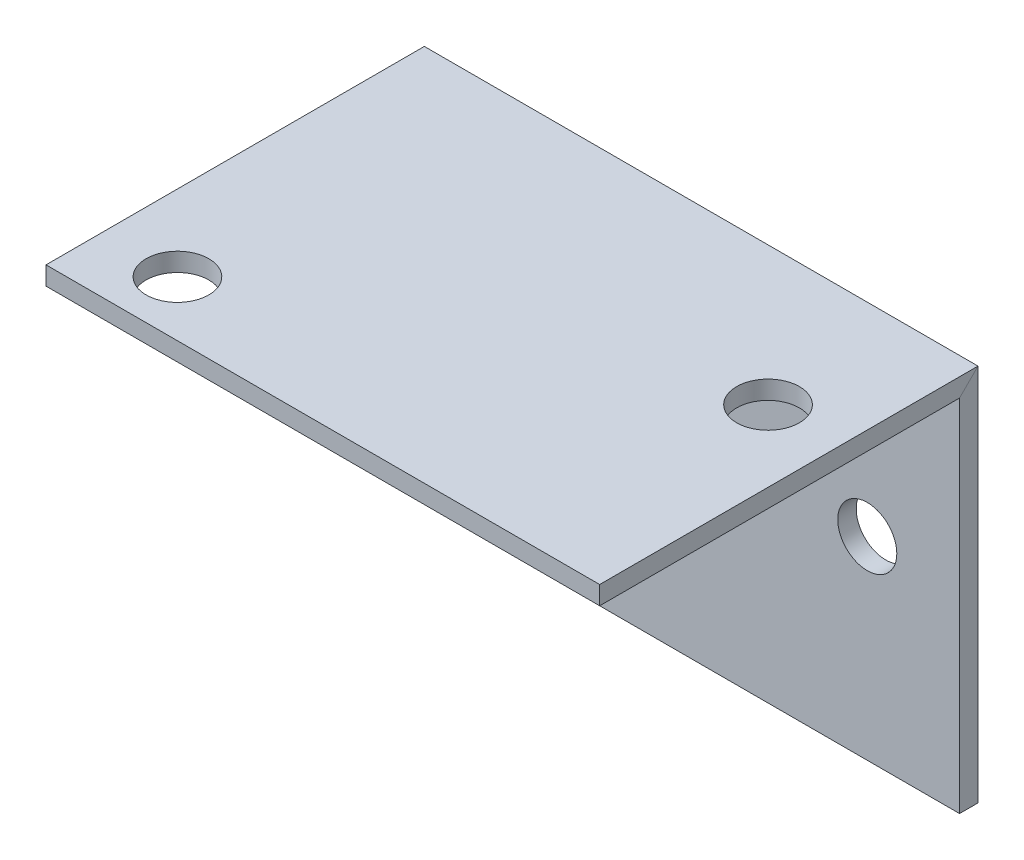
ISO-10303-21;
HEADER;
FILE_DESCRIPTION(('STEP AP214'),'2;1');
FILE_NAME('part.step','',(''),(''),'','','');
FILE_SCHEMA(('AUTOMOTIVE_DESIGN { 1 0 10303 214 1 1 1 1 }'));
ENDSEC;
DATA;
#1=APPLICATION_CONTEXT('core data for automotive mechanical design processes');
#2=APPLICATION_PROTOCOL_DEFINITION('international standard','automotive_design',2000,#1);
#3=PRODUCT_CONTEXT('',#1,'mechanical');
#4=PRODUCT('Part','Part','',(#3));
#5=PRODUCT_RELATED_PRODUCT_CATEGORY('part','',(#4));
#6=PRODUCT_DEFINITION_FORMATION('','',#4);
#7=PRODUCT_DEFINITION_CONTEXT('part definition',#1,'design');
#8=PRODUCT_DEFINITION('design','',#6,#7);
#9=PRODUCT_DEFINITION_SHAPE('','',#8);
#10=(LENGTH_UNIT() NAMED_UNIT(*) SI_UNIT(.MILLI.,.METRE.));
#11=(NAMED_UNIT(*) PLANE_ANGLE_UNIT() SI_UNIT($,.RADIAN.));
#12=(NAMED_UNIT(*) SI_UNIT($,.STERADIAN.) SOLID_ANGLE_UNIT());
#13=UNCERTAINTY_MEASURE_WITH_UNIT(LENGTH_MEASURE(1.E-05),#10,'distance_accuracy_value','');
#14=(GEOMETRIC_REPRESENTATION_CONTEXT(3) GLOBAL_UNCERTAINTY_ASSIGNED_CONTEXT((#13)) GLOBAL_UNIT_ASSIGNED_CONTEXT((#10,
#11,#12)) REPRESENTATION_CONTEXT('',''));
#15=CARTESIAN_POINT('',(0.,0.,0.));
#16=DIRECTION('',(0.,0.,1.));
#17=DIRECTION('',(1.,0.,0.));
#18=AXIS2_PLACEMENT_3D('',#15,#16,#17);
#19=CARTESIAN_POINT('',(0.,-20.,-20.));
#20=DIRECTION('',(0.,1.,0.));
#21=DIRECTION('',(1.,0.,0.));
#22=AXIS2_PLACEMENT_3D('',#19,#20,#21);
#23=PLANE('',#22);
#24=DIRECTION('',(0.,0.,-1.));
#25=VECTOR('',#24,1.);
#26=CARTESIAN_POINT('',(15.0000000000001,-20.,-20.5));
#27=LINE('',#26,#25);
#28=CARTESIAN_POINT('',(15.0000000000001,-20.,-19.5));
#29=VERTEX_POINT('',#28);
#30=CARTESIAN_POINT('',(15.0000000000001,-20.,-20.5));
#31=VERTEX_POINT('',#30);
#32=EDGE_CURVE('E137',#29,#31,#27,.T.);
#33=ORIENTED_EDGE('',*,*,#32,.F.);
#34=DIRECTION('',(1.,0.,0.));
#35=VECTOR('',#34,1.);
#36=CARTESIAN_POINT('',(-14.9999999999999,-20.,-19.5));
#37=LINE('',#36,#35);
#38=CARTESIAN_POINT('',(-14.9999999999999,-20.,-19.5));
#39=VERTEX_POINT('',#38);
#40=EDGE_CURVE('E140',#39,#29,#37,.T.);
#41=ORIENTED_EDGE('',*,*,#40,.F.);
#42=DIRECTION('',(0.,0.,1.));
#43=VECTOR('',#42,1.);
#44=CARTESIAN_POINT('',(-14.9999999999999,-20.,-20.5));
#45=LINE('',#44,#43);
#46=CARTESIAN_POINT('',(-14.9999999999999,-20.,-20.5));
#47=VERTEX_POINT('',#46);
#48=EDGE_CURVE('E71',#47,#39,#45,.T.);
#49=ORIENTED_EDGE('',*,*,#48,.F.);
#50=DIRECTION('',(-1.,0.,0.));
#51=VECTOR('',#50,1.);
#52=CARTESIAN_POINT('',(-14.9999999999999,-20.,-20.5));
#53=LINE('',#52,#51);
#54=EDGE_CURVE('E79',#31,#47,#53,.T.);
#55=ORIENTED_EDGE('',*,*,#54,.F.);
#56=EDGE_LOOP('',(#33,#41,#49,#55));
#57=FACE_BOUND('',#56,.T.);
#58=ADVANCED_FACE('F37',(#57),#23,.F.);
#59=CARTESIAN_POINT('',(0.,0.,0.));
#60=DIRECTION('',(0.,0.,1.));
#61=DIRECTION('',(1.,0.,0.));
#62=AXIS2_PLACEMENT_3D('',#59,#60,#61);
#63=PLANE('',#62);
#64=DIRECTION('',(0.,1.,0.));
#65=VECTOR('',#64,1.);
#66=CARTESIAN_POINT('',(15.0000000000001,0.5,0.));
#67=LINE('',#66,#65);
#68=CARTESIAN_POINT('',(15.0000000000001,-0.499999999999997,0.));
#69=VERTEX_POINT('',#68);
#70=CARTESIAN_POINT('',(15.0000000000001,0.5,0.));
#71=VERTEX_POINT('',#70);
#72=EDGE_CURVE('E124',#69,#71,#67,.T.);
#73=ORIENTED_EDGE('',*,*,#72,.T.);
#74=DIRECTION('',(-1.,0.,0.));
#75=VECTOR('',#74,1.);
#76=CARTESIAN_POINT('',(-14.9999999999999,0.5,0.));
#77=LINE('',#76,#75);
#78=CARTESIAN_POINT('',(-14.9999999999999,0.5,0.));
#79=VERTEX_POINT('',#78);
#80=EDGE_CURVE('E120',#71,#79,#77,.T.);
#81=ORIENTED_EDGE('',*,*,#80,.T.);
#82=DIRECTION('',(0.,-1.,0.));
#83=VECTOR('',#82,1.);
#84=CARTESIAN_POINT('',(-14.9999999999999,0.5,0.));
#85=LINE('',#84,#83);
#86=CARTESIAN_POINT('',(-14.9999999999999,-0.499999999999997,0.));
#87=VERTEX_POINT('',#86);
#88=EDGE_CURVE('E87',#79,#87,#85,.T.);
#89=ORIENTED_EDGE('',*,*,#88,.T.);
#90=DIRECTION('',(1.,0.,0.));
#91=VECTOR('',#90,1.);
#92=CARTESIAN_POINT('',(-14.9999999999999,-0.499999999999997,0.));
#93=LINE('',#92,#91);
#94=EDGE_CURVE('E128',#87,#69,#93,.T.);
#95=ORIENTED_EDGE('',*,*,#94,.T.);
#96=EDGE_LOOP('',(#73,#81,#89,#95));
#97=FACE_BOUND('',#96,.T.);
#98=ADVANCED_FACE('F153',(#97),#63,.T.);
#99=CARTESIAN_POINT('',(-14.9999999999999,0.649999999999998,-20.5));
#100=DIRECTION('',(1.,0.,0.));
#101=DIRECTION('',(0.,0.,-1.));
#102=AXIS2_PLACEMENT_3D('',#99,#100,#101);
#103=PLANE('',#102);
#104=DIRECTION('',(0.,0.707106781186548,-0.707106781186548));
#105=VECTOR('',#104,1.);
#106=CARTESIAN_POINT('',(-14.9999999999999,-9.75,-10.25));
#107=LINE('',#106,#105);
#108=CARTESIAN_POINT('',(-14.9999999999999,-0.499999999999999,-19.5));
#109=VERTEX_POINT('',#108);
#110=CARTESIAN_POINT('',(-14.9999999999999,0.499999999999998,-20.5));
#111=VERTEX_POINT('',#110);
#112=EDGE_CURVE('E110',#109,#111,#107,.T.);
#113=ORIENTED_EDGE('',*,*,#112,.T.);
#114=DIRECTION('',(0.,-1.,0.));
#115=VECTOR('',#114,1.);
#116=CARTESIAN_POINT('',(-14.9999999999999,0.649999999999998,-20.5));
#117=LINE('',#116,#115);
#118=EDGE_CURVE('E40',#111,#47,#117,.T.);
#119=ORIENTED_EDGE('',*,*,#118,.T.);
#120=ORIENTED_EDGE('',*,*,#48,.T.);
#121=DIRECTION('',(0.,-1.,0.));
#122=VECTOR('',#121,1.);
#123=CARTESIAN_POINT('',(-14.9999999999999,0.649999999999997,-19.5));
#124=LINE('',#123,#122);
#125=EDGE_CURVE('E114',#109,#39,#124,.T.);
#126=ORIENTED_EDGE('',*,*,#125,.F.);
#127=EDGE_LOOP('',(#113,#119,#120,#126));
#128=FACE_BOUND('',#127,.T.);
#129=ADVANCED_FACE('F115',(#128),#103,.F.);
#130=CARTESIAN_POINT('',(-14.9999999999999,0.649999999999997,-19.5));
#131=DIRECTION('',(0.,0.,-1.));
#132=DIRECTION('',(0.,1.,0.));
#133=AXIS2_PLACEMENT_3D('',#130,#131,#132);
#134=PLANE('',#133);
#135=CARTESIAN_POINT('',(10.,-9.5,-19.5));
#136=DIRECTION('',(0.,0.,1.));
#137=DIRECTION('',(1.,0.,0.));
#138=AXIS2_PLACEMENT_3D('',#135,#136,#137);
#139=CIRCLE('',#138,1.6);
#140=CARTESIAN_POINT('',(11.6,-9.5,-19.5));
#141=VERTEX_POINT('',#140);
#142=EDGE_CURVE('E174',#141,#141,#139,.T.);
#143=ORIENTED_EDGE('',*,*,#142,.F.);
#144=EDGE_LOOP('',(#143));
#145=FACE_BOUND('',#144,.T.);
#146=CARTESIAN_POINT('',(-10.,-9.5,-19.5));
#147=DIRECTION('',(0.,0.,1.));
#148=DIRECTION('',(-1.,0.,0.));
#149=AXIS2_PLACEMENT_3D('',#146,#147,#148);
#150=CIRCLE('',#149,1.6);
#151=CARTESIAN_POINT('',(-11.6,-9.5,-19.5));
#152=VERTEX_POINT('',#151);
#153=EDGE_CURVE('E171',#152,#152,#150,.T.);
#154=ORIENTED_EDGE('',*,*,#153,.F.);
#155=EDGE_LOOP('',(#154));
#156=FACE_BOUND('',#155,.T.);
#157=DIRECTION('',(-1.,0.,0.));
#158=VECTOR('',#157,1.);
#159=CARTESIAN_POINT('',(-14.9999999999999,-0.499999999999999,-19.5));
#160=LINE('',#159,#158);
#161=CARTESIAN_POINT('',(15.0000000000001,-0.499999999999999,-19.5));
#162=VERTEX_POINT('',#161);
#163=EDGE_CURVE('E11',#162,#109,#160,.T.);
#164=ORIENTED_EDGE('',*,*,#163,.T.);
#165=ORIENTED_EDGE('',*,*,#125,.T.);
#166=ORIENTED_EDGE('',*,*,#40,.T.);
#167=DIRECTION('',(0.,-1.,0.));
#168=VECTOR('',#167,1.);
#169=CARTESIAN_POINT('',(15.0000000000001,0.649999999999997,-19.5));
#170=LINE('',#169,#168);
#171=EDGE_CURVE('E145',#162,#29,#170,.T.);
#172=ORIENTED_EDGE('',*,*,#171,.F.);
#173=EDGE_LOOP('',(#164,#165,#166,#172));
#174=FACE_BOUND('',#173,.T.);
#175=ADVANCED_FACE('F148',(#145,#156,#174),#134,.F.);
#176=CARTESIAN_POINT('',(15.0000000000001,0.649999999999998,-20.5));
#177=DIRECTION('',(-1.,0.,0.));
#178=DIRECTION('',(0.,0.,1.));
#179=AXIS2_PLACEMENT_3D('',#176,#177,#178);
#180=PLANE('',#179);
#181=DIRECTION('',(0.,-0.707106781186548,0.707106781186548));
#182=VECTOR('',#181,1.);
#183=CARTESIAN_POINT('',(15.0000000000001,-9.75,-10.25));
#184=LINE('',#183,#182);
#185=CARTESIAN_POINT('',(15.0000000000001,0.499999999999998,-20.5));
#186=VERTEX_POINT('',#185);
#187=EDGE_CURVE('E46',#186,#162,#184,.T.);
#188=ORIENTED_EDGE('',*,*,#187,.T.);
#189=ORIENTED_EDGE('',*,*,#171,.T.);
#190=ORIENTED_EDGE('',*,*,#32,.T.);
#191=DIRECTION('',(0.,-1.,0.));
#192=VECTOR('',#191,1.);
#193=CARTESIAN_POINT('',(15.0000000000001,0.649999999999998,-20.5));
#194=LINE('',#193,#192);
#195=EDGE_CURVE('E143',#186,#31,#194,.T.);
#196=ORIENTED_EDGE('',*,*,#195,.F.);
#197=EDGE_LOOP('',(#188,#189,#190,#196));
#198=FACE_BOUND('',#197,.T.);
#199=ADVANCED_FACE('F191',(#198),#180,.F.);
#200=CARTESIAN_POINT('',(-14.9999999999999,0.649999999999998,-20.5));
#201=DIRECTION('',(0.,0.,1.));
#202=DIRECTION('',(0.,-1.,0.));
#203=AXIS2_PLACEMENT_3D('',#200,#201,#202);
#204=PLANE('',#203);
#205=CARTESIAN_POINT('',(10.,-9.5,-20.5));
#206=DIRECTION('',(0.,0.,1.));
#207=DIRECTION('',(1.,0.,0.));
#208=AXIS2_PLACEMENT_3D('',#205,#206,#207);
#209=CIRCLE('',#208,1.6);
#210=CARTESIAN_POINT('',(11.6,-9.5,-20.5));
#211=VERTEX_POINT('',#210);
#212=EDGE_CURVE('E160',#211,#211,#209,.T.);
#213=ORIENTED_EDGE('',*,*,#212,.T.);
#214=EDGE_LOOP('',(#213));
#215=FACE_BOUND('',#214,.T.);
#216=CARTESIAN_POINT('',(-10.,-9.5,-20.5));
#217=DIRECTION('',(0.,0.,1.));
#218=DIRECTION('',(-1.,0.,0.));
#219=AXIS2_PLACEMENT_3D('',#216,#217,#218);
#220=CIRCLE('',#219,1.6);
#221=CARTESIAN_POINT('',(-11.6,-9.5,-20.5));
#222=VERTEX_POINT('',#221);
#223=EDGE_CURVE('E168',#222,#222,#220,.T.);
#224=ORIENTED_EDGE('',*,*,#223,.T.);
#225=EDGE_LOOP('',(#224));
#226=FACE_BOUND('',#225,.T.);
#227=DIRECTION('',(1.,0.,0.));
#228=VECTOR('',#227,1.);
#229=CARTESIAN_POINT('',(-14.9999999999999,0.499999999999999,-20.5));
#230=LINE('',#229,#228);
#231=EDGE_CURVE('E105',#111,#186,#230,.T.);
#232=ORIENTED_EDGE('',*,*,#231,.T.);
#233=ORIENTED_EDGE('',*,*,#195,.T.);
#234=ORIENTED_EDGE('',*,*,#54,.T.);
#235=ORIENTED_EDGE('',*,*,#118,.F.);
#236=EDGE_LOOP('',(#232,#233,#234,#235));
#237=FACE_BOUND('',#236,.T.);
#238=ADVANCED_FACE('F113',(#215,#226,#237),#204,.F.);
#239=CARTESIAN_POINT('',(-14.9999999999999,0.5,0.));
#240=DIRECTION('',(0.,-1.,0.));
#241=DIRECTION('',(0.,0.,-1.));
#242=AXIS2_PLACEMENT_3D('',#239,#240,#241);
#243=PLANE('',#242);
#244=CARTESIAN_POINT('',(-10.8772969776157,0.500000000000002,-3.00000000000001));
#245=DIRECTION('',(0.,-1.,0.));
#246=DIRECTION('',(0.,0.,-1.));
#247=AXIS2_PLACEMENT_3D('',#244,#245,#246);
#248=CIRCLE('',#247,1.7);
#249=CARTESIAN_POINT('',(-10.8772969776157,0.500000000000002,-4.7));
#250=VERTEX_POINT('',#249);
#251=EDGE_CURVE('E138',#250,#250,#248,.T.);
#252=ORIENTED_EDGE('',*,*,#251,.T.);
#253=EDGE_LOOP('',(#252));
#254=FACE_BOUND('',#253,.T.);
#255=CARTESIAN_POINT('',(11.1227030223843,0.500000000000001,-13.));
#256=DIRECTION('',(0.,-1.,0.));
#257=DIRECTION('',(0.,0.,-1.));
#258=AXIS2_PLACEMENT_3D('',#255,#256,#257);
#259=CIRCLE('',#258,1.7);
#260=CARTESIAN_POINT('',(11.1227030223843,0.500000000000001,-14.7));
#261=VERTEX_POINT('',#260);
#262=EDGE_CURVE('E156',#261,#261,#259,.T.);
#263=ORIENTED_EDGE('',*,*,#262,.T.);
#264=EDGE_LOOP('',(#263));
#265=FACE_BOUND('',#264,.T.);
#266=DIRECTION('',(0.,0.,-1.));
#267=VECTOR('',#266,1.);
#268=CARTESIAN_POINT('',(-14.9999999999999,0.5,0.));
#269=LINE('',#268,#267);
#270=EDGE_CURVE('E107',#79,#111,#269,.T.);
#271=ORIENTED_EDGE('',*,*,#270,.F.);
#272=ORIENTED_EDGE('',*,*,#80,.F.);
#273=DIRECTION('',(0.,0.,-1.));
#274=VECTOR('',#273,1.);
#275=CARTESIAN_POINT('',(15.0000000000001,0.5,0.));
#276=LINE('',#275,#274);
#277=EDGE_CURVE('E109',#71,#186,#276,.T.);
#278=ORIENTED_EDGE('',*,*,#277,.T.);
#279=ORIENTED_EDGE('',*,*,#231,.F.);
#280=EDGE_LOOP('',(#271,#272,#278,#279));
#281=FACE_BOUND('',#280,.T.);
#282=ADVANCED_FACE('F106',(#254,#265,#281),#243,.F.);
#283=CARTESIAN_POINT('',(15.0000000000001,0.5,0.));
#284=DIRECTION('',(-1.,0.,0.));
#285=DIRECTION('',(0.,0.,1.));
#286=AXIS2_PLACEMENT_3D('',#283,#284,#285);
#287=PLANE('',#286);
#288=ORIENTED_EDGE('',*,*,#277,.F.);
#289=ORIENTED_EDGE('',*,*,#72,.F.);
#290=DIRECTION('',(0.,0.,-1.));
#291=VECTOR('',#290,1.);
#292=CARTESIAN_POINT('',(15.0000000000001,-0.499999999999997,0.));
#293=LINE('',#292,#291);
#294=EDGE_CURVE('E122',#69,#162,#293,.T.);
#295=ORIENTED_EDGE('',*,*,#294,.T.);
#296=ORIENTED_EDGE('',*,*,#187,.F.);
#297=EDGE_LOOP('',(#288,#289,#295,#296));
#298=FACE_BOUND('',#297,.T.);
#299=ADVANCED_FACE('F214',(#298),#287,.F.);
#300=CARTESIAN_POINT('',(-14.9999999999999,-0.499999999999997,0.));
#301=DIRECTION('',(0.,1.,0.));
#302=DIRECTION('',(0.,0.,1.));
#303=AXIS2_PLACEMENT_3D('',#300,#301,#302);
#304=PLANE('',#303);
#305=CARTESIAN_POINT('',(-10.8772969776157,-0.499999999999997,-3.00000000000001));
#306=DIRECTION('',(0.,-1.,0.));
#307=DIRECTION('',(0.,0.,-1.));
#308=AXIS2_PLACEMENT_3D('',#305,#306,#307);
#309=CIRCLE('',#308,1.7);
#310=CARTESIAN_POINT('',(-10.8772969776157,-0.499999999999997,-4.7));
#311=VERTEX_POINT('',#310);
#312=EDGE_CURVE('E163',#311,#311,#309,.T.);
#313=ORIENTED_EDGE('',*,*,#312,.F.);
#314=EDGE_LOOP('',(#313));
#315=FACE_BOUND('',#314,.T.);
#316=CARTESIAN_POINT('',(11.1227030223843,-0.499999999999998,-13.));
#317=DIRECTION('',(0.,-1.,0.));
#318=DIRECTION('',(0.,0.,-1.));
#319=AXIS2_PLACEMENT_3D('',#316,#317,#318);
#320=CIRCLE('',#319,1.7);
#321=CARTESIAN_POINT('',(11.1227030223843,-0.499999999999998,-14.7));
#322=VERTEX_POINT('',#321);
#323=EDGE_CURVE('E159',#322,#322,#320,.T.);
#324=ORIENTED_EDGE('',*,*,#323,.F.);
#325=EDGE_LOOP('',(#324));
#326=FACE_BOUND('',#325,.T.);
#327=ORIENTED_EDGE('',*,*,#294,.F.);
#328=ORIENTED_EDGE('',*,*,#94,.F.);
#329=DIRECTION('',(0.,0.,-1.));
#330=VECTOR('',#329,1.);
#331=CARTESIAN_POINT('',(-14.9999999999999,-0.499999999999997,0.));
#332=LINE('',#331,#330);
#333=EDGE_CURVE('E119',#87,#109,#332,.T.);
#334=ORIENTED_EDGE('',*,*,#333,.T.);
#335=ORIENTED_EDGE('',*,*,#163,.F.);
#336=EDGE_LOOP('',(#327,#328,#334,#335));
#337=FACE_BOUND('',#336,.T.);
#338=ADVANCED_FACE('F151',(#315,#326,#337),#304,.F.);
#339=CARTESIAN_POINT('',(-14.9999999999999,0.5,0.));
#340=DIRECTION('',(1.,0.,0.));
#341=DIRECTION('',(0.,0.,-1.));
#342=AXIS2_PLACEMENT_3D('',#339,#340,#341);
#343=PLANE('',#342);
#344=ORIENTED_EDGE('',*,*,#333,.F.);
#345=ORIENTED_EDGE('',*,*,#88,.F.);
#346=ORIENTED_EDGE('',*,*,#270,.T.);
#347=ORIENTED_EDGE('',*,*,#112,.F.);
#348=EDGE_LOOP('',(#344,#345,#346,#347));
#349=FACE_BOUND('',#348,.T.);
#350=ADVANCED_FACE('F118',(#349),#343,.F.);
#351=CARTESIAN_POINT('',(11.1227030223843,0.500000000000001,-13.));
#352=DIRECTION('',(0.,-1.,0.));
#353=DIRECTION('',(0.,0.,-1.));
#354=AXIS2_PLACEMENT_3D('',#351,#352,#353);
#355=CYLINDRICAL_SURFACE('',#354,1.7);
#356=ORIENTED_EDGE('',*,*,#262,.F.);
#357=EDGE_LOOP('',(#356));
#358=FACE_BOUND('',#357,.T.);
#359=ORIENTED_EDGE('',*,*,#323,.T.);
#360=EDGE_LOOP('',(#359));
#361=FACE_BOUND('',#360,.T.);
#362=ADVANCED_FACE('F202',(#358,#361),#355,.F.);
#363=CARTESIAN_POINT('',(-10.8772969776157,0.500000000000002,-3.00000000000001));
#364=DIRECTION('',(0.,-1.,0.));
#365=DIRECTION('',(0.,0.,-1.));
#366=AXIS2_PLACEMENT_3D('',#363,#364,#365);
#367=CYLINDRICAL_SURFACE('',#366,1.7);
#368=ORIENTED_EDGE('',*,*,#251,.F.);
#369=EDGE_LOOP('',(#368));
#370=FACE_BOUND('',#369,.T.);
#371=ORIENTED_EDGE('',*,*,#312,.T.);
#372=EDGE_LOOP('',(#371));
#373=FACE_BOUND('',#372,.T.);
#374=ADVANCED_FACE('F196',(#370,#373),#367,.F.);
#375=CARTESIAN_POINT('',(-10.,-9.5,-20.5));
#376=DIRECTION('',(0.,0.,1.));
#377=DIRECTION('',(1.,0.,0.));
#378=AXIS2_PLACEMENT_3D('',#375,#376,#377);
#379=CYLINDRICAL_SURFACE('',#378,1.6);
#380=ORIENTED_EDGE('',*,*,#223,.F.);
#381=EDGE_LOOP('',(#380));
#382=FACE_BOUND('',#381,.T.);
#383=ORIENTED_EDGE('',*,*,#153,.T.);
#384=EDGE_LOOP('',(#383));
#385=FACE_BOUND('',#384,.T.);
#386=ADVANCED_FACE('F185',(#382,#385),#379,.F.);
#387=CARTESIAN_POINT('',(10.,-9.5,-20.5));
#388=DIRECTION('',(0.,0.,1.));
#389=DIRECTION('',(1.,0.,0.));
#390=AXIS2_PLACEMENT_3D('',#387,#388,#389);
#391=CYLINDRICAL_SURFACE('',#390,1.6);
#392=ORIENTED_EDGE('',*,*,#212,.F.);
#393=EDGE_LOOP('',(#392));
#394=FACE_BOUND('',#393,.T.);
#395=ORIENTED_EDGE('',*,*,#142,.T.);
#396=EDGE_LOOP('',(#395));
#397=FACE_BOUND('',#396,.T.);
#398=ADVANCED_FACE('F182',(#394,#397),#391,.F.);
#399=CLOSED_SHELL('',(#58,#98,#129,#175,#199,#238,#282,#299,#338,#350,#362,#374,#386,#398));
#400=MANIFOLD_SOLID_BREP('B2',#399);
#401=ADVANCED_BREP_SHAPE_REPRESENTATION('',(#18,#400),#14);
#402=SHAPE_DEFINITION_REPRESENTATION(#9,#401);
ENDSEC;
END-ISO-10303-21;
